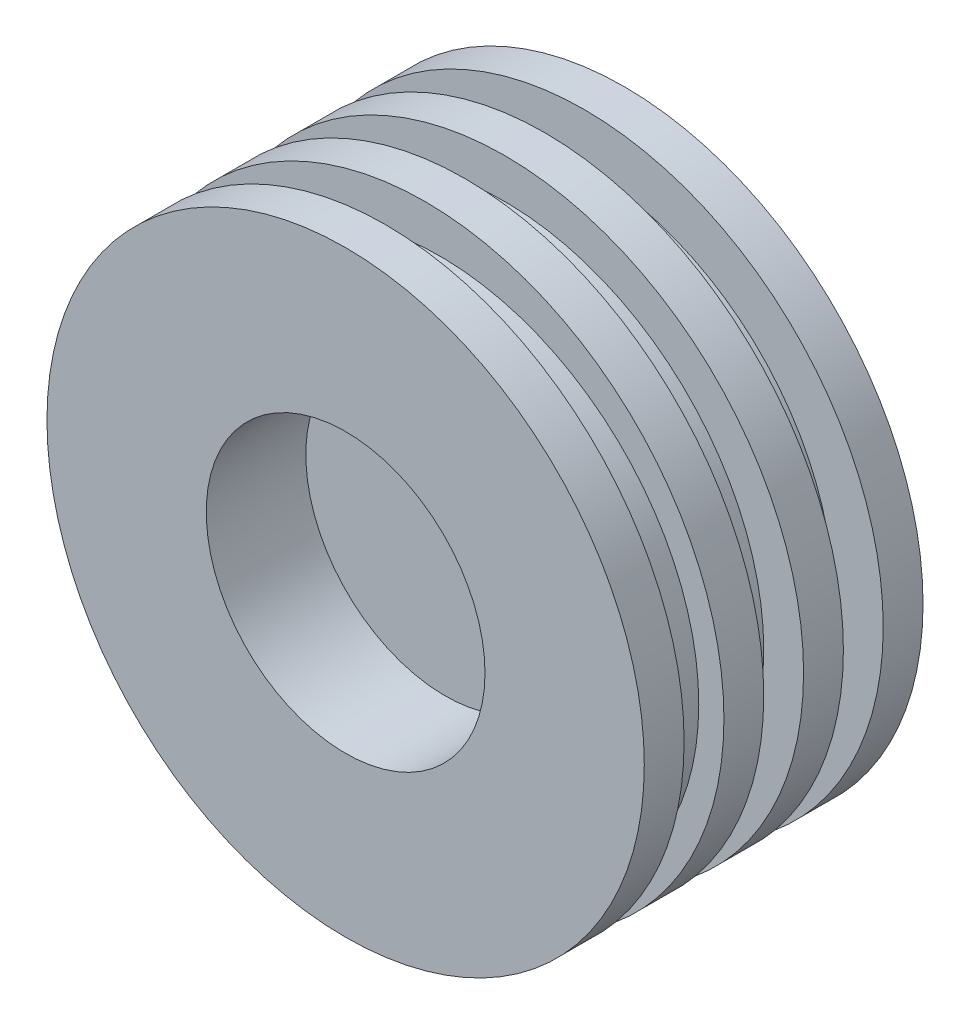
ISO-10303-21;
HEADER;
FILE_DESCRIPTION(('STEP AP214'),'2;1');
FILE_NAME('part.step','',(''),(''),'','','');
FILE_SCHEMA(('AUTOMOTIVE_DESIGN { 1 0 10303 214 1 1 1 1 }'));
ENDSEC;
DATA;
#1=APPLICATION_CONTEXT('core data for automotive mechanical design processes');
#2=APPLICATION_PROTOCOL_DEFINITION('international standard','automotive_design',2000,#1);
#3=PRODUCT_CONTEXT('',#1,'mechanical');
#4=PRODUCT('Part','Part','',(#3));
#5=PRODUCT_RELATED_PRODUCT_CATEGORY('part','',(#4));
#6=PRODUCT_DEFINITION_FORMATION('','',#4);
#7=PRODUCT_DEFINITION_CONTEXT('part definition',#1,'design');
#8=PRODUCT_DEFINITION('design','',#6,#7);
#9=PRODUCT_DEFINITION_SHAPE('','',#8);
#10=(LENGTH_UNIT() NAMED_UNIT(*) SI_UNIT(.MILLI.,.METRE.));
#11=(NAMED_UNIT(*) PLANE_ANGLE_UNIT() SI_UNIT($,.RADIAN.));
#12=(NAMED_UNIT(*) SI_UNIT($,.STERADIAN.) SOLID_ANGLE_UNIT());
#13=UNCERTAINTY_MEASURE_WITH_UNIT(LENGTH_MEASURE(1.E-05),#10,'distance_accuracy_value','');
#14=(GEOMETRIC_REPRESENTATION_CONTEXT(3) GLOBAL_UNCERTAINTY_ASSIGNED_CONTEXT((#13)) GLOBAL_UNIT_ASSIGNED_CONTEXT((#10,
#11,#12)) REPRESENTATION_CONTEXT('',''));
#15=CARTESIAN_POINT('',(0.,0.,0.));
#16=DIRECTION('',(0.,0.,1.));
#17=DIRECTION('',(1.,0.,0.));
#18=AXIS2_PLACEMENT_3D('',#15,#16,#17);
#19=CARTESIAN_POINT('',(0.,0.,2.));
#20=DIRECTION('',(0.,0.,-1.));
#21=DIRECTION('',(-1.,0.,0.));
#22=AXIS2_PLACEMENT_3D('',#19,#20,#21);
#23=CYLINDRICAL_SURFACE('',#22,15.);
#24=CARTESIAN_POINT('',(0.,0.,2.));
#25=DIRECTION('',(0.,0.,1.));
#26=DIRECTION('',(1.,0.,0.));
#27=AXIS2_PLACEMENT_3D('',#24,#25,#26);
#28=CIRCLE('',#27,15.);
#29=CARTESIAN_POINT('',(15.,0.,2.));
#30=VERTEX_POINT('',#29);
#31=EDGE_CURVE('E70',#30,#30,#28,.T.);
#32=ORIENTED_EDGE('',*,*,#31,.F.);
#33=EDGE_LOOP('',(#32));
#34=FACE_BOUND('',#33,.T.);
#35=CARTESIAN_POINT('',(0.,0.,0.));
#36=DIRECTION('',(0.,0.,1.));
#37=DIRECTION('',(1.,0.,0.));
#38=AXIS2_PLACEMENT_3D('',#35,#36,#37);
#39=CIRCLE('',#38,15.);
#40=CARTESIAN_POINT('',(15.,0.,0.));
#41=VERTEX_POINT('',#40);
#42=EDGE_CURVE('E36',#41,#41,#39,.T.);
#43=ORIENTED_EDGE('',*,*,#42,.T.);
#44=EDGE_LOOP('',(#43));
#45=FACE_BOUND('',#44,.T.);
#46=ADVANCED_FACE('F33',(#34,#45),#23,.T.);
#47=CARTESIAN_POINT('',(0.,0.,2.));
#48=DIRECTION('',(0.,0.,1.));
#49=DIRECTION('',(1.,0.,0.));
#50=AXIS2_PLACEMENT_3D('',#47,#48,#49);
#51=PLANE('',#50);
#52=CARTESIAN_POINT('',(0.,0.,2.));
#53=DIRECTION('',(0.,0.,1.));
#54=DIRECTION('',(1.,0.,0.));
#55=AXIS2_PLACEMENT_3D('',#52,#53,#54);
#56=CIRCLE('',#55,12.5);
#57=CARTESIAN_POINT('',(12.5,0.,2.));
#58=VERTEX_POINT('',#57);
#59=EDGE_CURVE('E45',#58,#58,#56,.T.);
#60=ORIENTED_EDGE('',*,*,#59,.F.);
#61=EDGE_LOOP('',(#60));
#62=FACE_BOUND('',#61,.T.);
#63=ORIENTED_EDGE('',*,*,#31,.T.);
#64=EDGE_LOOP('',(#63));
#65=FACE_BOUND('',#64,.T.);
#66=ADVANCED_FACE('F81',(#62,#65),#51,.T.);
#67=CARTESIAN_POINT('',(0.,0.,0.));
#68=DIRECTION('',(0.,0.,1.));
#69=DIRECTION('',(1.,0.,0.));
#70=AXIS2_PLACEMENT_3D('',#67,#68,#69);
#71=PLANE('',#70);
#72=ORIENTED_EDGE('',*,*,#42,.F.);
#73=EDGE_LOOP('',(#72));
#74=FACE_BOUND('',#73,.T.);
#75=ADVANCED_FACE('F78',(#74),#71,.F.);
#76=CARTESIAN_POINT('',(0.,0.,4.));
#77=DIRECTION('',(0.,0.,-1.));
#78=DIRECTION('',(-1.,0.,0.));
#79=AXIS2_PLACEMENT_3D('',#76,#77,#78);
#80=CYLINDRICAL_SURFACE('',#79,12.5);
#81=CARTESIAN_POINT('',(0.,0.,4.));
#82=DIRECTION('',(0.,0.,1.));
#83=DIRECTION('',(1.,0.,0.));
#84=AXIS2_PLACEMENT_3D('',#81,#82,#83);
#85=CIRCLE('',#84,12.5);
#86=CARTESIAN_POINT('',(12.5,0.,4.));
#87=VERTEX_POINT('',#86);
#88=EDGE_CURVE('E64',#87,#87,#85,.T.);
#89=ORIENTED_EDGE('',*,*,#88,.F.);
#90=EDGE_LOOP('',(#89));
#91=FACE_BOUND('',#90,.T.);
#92=ORIENTED_EDGE('',*,*,#59,.T.);
#93=EDGE_LOOP('',(#92));
#94=FACE_BOUND('',#93,.T.);
#95=ADVANCED_FACE('F80',(#91,#94),#80,.T.);
#96=CARTESIAN_POINT('',(0.,0.,6.));
#97=DIRECTION('',(0.,0.,-1.));
#98=DIRECTION('',(-1.,0.,0.));
#99=AXIS2_PLACEMENT_3D('',#96,#97,#98);
#100=CYLINDRICAL_SURFACE('',#99,15.);
#101=CARTESIAN_POINT('',(0.,0.,6.));
#102=DIRECTION('',(0.,0.,1.));
#103=DIRECTION('',(1.,0.,0.));
#104=AXIS2_PLACEMENT_3D('',#101,#102,#103);
#105=CIRCLE('',#104,15.);
#106=CARTESIAN_POINT('',(15.,0.,6.));
#107=VERTEX_POINT('',#106);
#108=EDGE_CURVE('E61',#107,#107,#105,.T.);
#109=ORIENTED_EDGE('',*,*,#108,.F.);
#110=EDGE_LOOP('',(#109));
#111=FACE_BOUND('',#110,.T.);
#112=CARTESIAN_POINT('',(0.,0.,4.));
#113=DIRECTION('',(0.,0.,1.));
#114=DIRECTION('',(1.,0.,0.));
#115=AXIS2_PLACEMENT_3D('',#112,#113,#114);
#116=CIRCLE('',#115,15.);
#117=CARTESIAN_POINT('',(15.,0.,4.));
#118=VERTEX_POINT('',#117);
#119=EDGE_CURVE('E59',#118,#118,#116,.T.);
#120=ORIENTED_EDGE('',*,*,#119,.T.);
#121=EDGE_LOOP('',(#120));
#122=FACE_BOUND('',#121,.T.);
#123=ADVANCED_FACE('F86',(#111,#122),#100,.T.);
#124=CARTESIAN_POINT('',(0.,0.,6.));
#125=DIRECTION('',(0.,0.,1.));
#126=DIRECTION('',(1.,0.,0.));
#127=AXIS2_PLACEMENT_3D('',#124,#125,#126);
#128=PLANE('',#127);
#129=CARTESIAN_POINT('',(0.,0.,6.));
#130=DIRECTION('',(0.,0.,1.));
#131=DIRECTION('',(1.,0.,0.));
#132=AXIS2_PLACEMENT_3D('',#129,#130,#131);
#133=CIRCLE('',#132,13.);
#134=CARTESIAN_POINT('',(13.,0.,6.));
#135=VERTEX_POINT('',#134);
#136=EDGE_CURVE('E40',#135,#135,#133,.T.);
#137=ORIENTED_EDGE('',*,*,#136,.F.);
#138=EDGE_LOOP('',(#137));
#139=FACE_BOUND('',#138,.T.);
#140=ORIENTED_EDGE('',*,*,#108,.T.);
#141=EDGE_LOOP('',(#140));
#142=FACE_BOUND('',#141,.T.);
#143=ADVANCED_FACE('F116',(#139,#142),#128,.T.);
#144=CARTESIAN_POINT('',(0.,0.,4.));
#145=DIRECTION('',(0.,0.,1.));
#146=DIRECTION('',(1.,0.,0.));
#147=AXIS2_PLACEMENT_3D('',#144,#145,#146);
#148=PLANE('',#147);
#149=ORIENTED_EDGE('',*,*,#88,.T.);
#150=EDGE_LOOP('',(#149));
#151=FACE_BOUND('',#150,.T.);
#152=ORIENTED_EDGE('',*,*,#119,.F.);
#153=EDGE_LOOP('',(#152));
#154=FACE_BOUND('',#153,.T.);
#155=ADVANCED_FACE('F124',(#151,#154),#148,.F.);
#156=CARTESIAN_POINT('',(0.,0.,8.));
#157=DIRECTION('',(0.,0.,-1.));
#158=DIRECTION('',(-1.,0.,0.));
#159=AXIS2_PLACEMENT_3D('',#156,#157,#158);
#160=CYLINDRICAL_SURFACE('',#159,13.);
#161=CARTESIAN_POINT('',(0.,0.,8.));
#162=DIRECTION('',(0.,0.,1.));
#163=DIRECTION('',(1.,0.,0.));
#164=AXIS2_PLACEMENT_3D('',#161,#162,#163);
#165=CIRCLE('',#164,13.);
#166=CARTESIAN_POINT('',(13.,0.,8.));
#167=VERTEX_POINT('',#166);
#168=EDGE_CURVE('E54',#167,#167,#165,.T.);
#169=ORIENTED_EDGE('',*,*,#168,.F.);
#170=EDGE_LOOP('',(#169));
#171=FACE_BOUND('',#170,.T.);
#172=ORIENTED_EDGE('',*,*,#136,.T.);
#173=EDGE_LOOP('',(#172));
#174=FACE_BOUND('',#173,.T.);
#175=ADVANCED_FACE('F129',(#171,#174),#160,.T.);
#176=CARTESIAN_POINT('',(0.,0.,10.));
#177=DIRECTION('',(0.,0.,-1.));
#178=DIRECTION('',(-1.,0.,0.));
#179=AXIS2_PLACEMENT_3D('',#176,#177,#178);
#180=CYLINDRICAL_SURFACE('',#179,15.);
#181=CARTESIAN_POINT('',(0.,0.,10.));
#182=DIRECTION('',(0.,0.,1.));
#183=DIRECTION('',(1.,0.,0.));
#184=AXIS2_PLACEMENT_3D('',#181,#182,#183);
#185=CIRCLE('',#184,15.);
#186=CARTESIAN_POINT('',(15.,0.,10.));
#187=VERTEX_POINT('',#186);
#188=EDGE_CURVE('E51',#187,#187,#185,.T.);
#189=ORIENTED_EDGE('',*,*,#188,.F.);
#190=EDGE_LOOP('',(#189));
#191=FACE_BOUND('',#190,.T.);
#192=CARTESIAN_POINT('',(0.,0.,8.));
#193=DIRECTION('',(0.,0.,1.));
#194=DIRECTION('',(1.,0.,0.));
#195=AXIS2_PLACEMENT_3D('',#192,#193,#194);
#196=CIRCLE('',#195,15.);
#197=CARTESIAN_POINT('',(15.,0.,8.));
#198=VERTEX_POINT('',#197);
#199=EDGE_CURVE('E55',#198,#198,#196,.T.);
#200=ORIENTED_EDGE('',*,*,#199,.T.);
#201=EDGE_LOOP('',(#200));
#202=FACE_BOUND('',#201,.T.);
#203=ADVANCED_FACE('F146',(#191,#202),#180,.T.);
#204=CARTESIAN_POINT('',(0.,0.,10.));
#205=DIRECTION('',(0.,0.,1.));
#206=DIRECTION('',(1.,0.,0.));
#207=AXIS2_PLACEMENT_3D('',#204,#205,#206);
#208=PLANE('',#207);
#209=CARTESIAN_POINT('',(0.7361946892388,0.,10.));
#210=DIRECTION('',(0.,0.,1.));
#211=DIRECTION('',(1.,0.,0.));
#212=AXIS2_PLACEMENT_3D('',#209,#210,#211);
#213=CIRCLE('',#212,13.);
#214=CARTESIAN_POINT('',(13.7361946892388,0.,10.));
#215=VERTEX_POINT('',#214);
#216=EDGE_CURVE('E10',#215,#215,#213,.T.);
#217=ORIENTED_EDGE('',*,*,#216,.F.);
#218=EDGE_LOOP('',(#217));
#219=FACE_BOUND('',#218,.T.);
#220=ORIENTED_EDGE('',*,*,#188,.T.);
#221=EDGE_LOOP('',(#220));
#222=FACE_BOUND('',#221,.T.);
#223=ADVANCED_FACE('F156',(#219,#222),#208,.T.);
#224=CARTESIAN_POINT('',(0.,0.,8.));
#225=DIRECTION('',(0.,0.,1.));
#226=DIRECTION('',(1.,0.,0.));
#227=AXIS2_PLACEMENT_3D('',#224,#225,#226);
#228=PLANE('',#227);
#229=ORIENTED_EDGE('',*,*,#168,.T.);
#230=EDGE_LOOP('',(#229));
#231=FACE_BOUND('',#230,.T.);
#232=ORIENTED_EDGE('',*,*,#199,.F.);
#233=EDGE_LOOP('',(#232));
#234=FACE_BOUND('',#233,.T.);
#235=ADVANCED_FACE('F164',(#231,#234),#228,.F.);
#236=CARTESIAN_POINT('',(0.7361946892388,0.,12.));
#237=DIRECTION('',(0.,0.,-1.));
#238=DIRECTION('',(-1.,0.,0.));
#239=AXIS2_PLACEMENT_3D('',#236,#237,#238);
#240=CYLINDRICAL_SURFACE('',#239,13.);
#241=CARTESIAN_POINT('',(0.7361946892388,0.,12.));
#242=DIRECTION('',(0.,0.,1.));
#243=DIRECTION('',(1.,0.,0.));
#244=AXIS2_PLACEMENT_3D('',#241,#242,#243);
#245=CIRCLE('',#244,13.);
#246=CARTESIAN_POINT('',(13.7361946892388,0.,12.));
#247=VERTEX_POINT('',#246);
#248=EDGE_CURVE('E49',#247,#247,#245,.T.);
#249=ORIENTED_EDGE('',*,*,#248,.F.);
#250=EDGE_LOOP('',(#249));
#251=FACE_BOUND('',#250,.T.);
#252=ORIENTED_EDGE('',*,*,#216,.T.);
#253=EDGE_LOOP('',(#252));
#254=FACE_BOUND('',#253,.T.);
#255=ADVANCED_FACE('F169',(#251,#254),#240,.T.);
#256=CARTESIAN_POINT('',(0.,0.,14.));
#257=DIRECTION('',(0.,0.,-1.));
#258=DIRECTION('',(-1.,0.,0.));
#259=AXIS2_PLACEMENT_3D('',#256,#257,#258);
#260=CYLINDRICAL_SURFACE('',#259,15.);
#261=CARTESIAN_POINT('',(0.,0.,14.));
#262=DIRECTION('',(0.,0.,1.));
#263=DIRECTION('',(1.,0.,0.));
#264=AXIS2_PLACEMENT_3D('',#261,#262,#263);
#265=CIRCLE('',#264,15.);
#266=CARTESIAN_POINT('',(15.,0.,14.));
#267=VERTEX_POINT('',#266);
#268=EDGE_CURVE('E247',#267,#267,#265,.T.);
#269=ORIENTED_EDGE('',*,*,#268,.F.);
#270=EDGE_LOOP('',(#269));
#271=FACE_BOUND('',#270,.T.);
#272=CARTESIAN_POINT('',(0.,0.,12.));
#273=DIRECTION('',(0.,0.,1.));
#274=DIRECTION('',(1.,0.,0.));
#275=AXIS2_PLACEMENT_3D('',#272,#273,#274);
#276=CIRCLE('',#275,15.);
#277=CARTESIAN_POINT('',(15.,0.,12.));
#278=VERTEX_POINT('',#277);
#279=EDGE_CURVE('E243',#278,#278,#276,.T.);
#280=ORIENTED_EDGE('',*,*,#279,.T.);
#281=EDGE_LOOP('',(#280));
#282=FACE_BOUND('',#281,.T.);
#283=ADVANCED_FACE('F186',(#271,#282),#260,.T.);
#284=CARTESIAN_POINT('',(0.,0.,14.));
#285=DIRECTION('',(0.,0.,1.));
#286=DIRECTION('',(1.,0.,0.));
#287=AXIS2_PLACEMENT_3D('',#284,#285,#286);
#288=PLANE('',#287);
#289=CARTESIAN_POINT('',(0.,0.,14.));
#290=DIRECTION('',(0.,0.,1.));
#291=DIRECTION('',(1.,0.,0.));
#292=AXIS2_PLACEMENT_3D('',#289,#290,#291);
#293=CIRCLE('',#292,7.);
#294=CARTESIAN_POINT('',(7.,0.,14.));
#295=VERTEX_POINT('',#294);
#296=EDGE_CURVE('E244',#295,#295,#293,.T.);
#297=ORIENTED_EDGE('',*,*,#296,.F.);
#298=EDGE_LOOP('',(#297));
#299=FACE_BOUND('',#298,.T.);
#300=ORIENTED_EDGE('',*,*,#268,.T.);
#301=EDGE_LOOP('',(#300));
#302=FACE_BOUND('',#301,.T.);
#303=ADVANCED_FACE('F196',(#299,#302),#288,.T.);
#304=CARTESIAN_POINT('',(0.,0.,12.));
#305=DIRECTION('',(0.,0.,1.));
#306=DIRECTION('',(1.,0.,0.));
#307=AXIS2_PLACEMENT_3D('',#304,#305,#306);
#308=PLANE('',#307);
#309=ORIENTED_EDGE('',*,*,#248,.T.);
#310=EDGE_LOOP('',(#309));
#311=FACE_BOUND('',#310,.T.);
#312=ORIENTED_EDGE('',*,*,#279,.F.);
#313=EDGE_LOOP('',(#312));
#314=FACE_BOUND('',#313,.T.);
#315=ADVANCED_FACE('F204',(#311,#314),#308,.F.);
#316=CARTESIAN_POINT('',(0.,0.,9.));
#317=DIRECTION('',(0.,0.,1.));
#318=DIRECTION('',(1.,0.,0.));
#319=AXIS2_PLACEMENT_3D('',#316,#317,#318);
#320=CYLINDRICAL_SURFACE('',#319,7.);
#321=CARTESIAN_POINT('',(0.,0.,9.));
#322=DIRECTION('',(0.,0.,1.));
#323=DIRECTION('',(1.,0.,0.));
#324=AXIS2_PLACEMENT_3D('',#321,#322,#323);
#325=CIRCLE('',#324,7.);
#326=CARTESIAN_POINT('',(7.,0.,9.));
#327=VERTEX_POINT('',#326);
#328=EDGE_CURVE('E242',#327,#327,#325,.T.);
#329=ORIENTED_EDGE('',*,*,#328,.F.);
#330=EDGE_LOOP('',(#329));
#331=FACE_BOUND('',#330,.T.);
#332=ORIENTED_EDGE('',*,*,#296,.T.);
#333=EDGE_LOOP('',(#332));
#334=FACE_BOUND('',#333,.T.);
#335=ADVANCED_FACE('F209',(#331,#334),#320,.F.);
#336=CARTESIAN_POINT('',(0.,0.,9.));
#337=DIRECTION('',(0.,0.,1.));
#338=DIRECTION('',(1.,0.,0.));
#339=AXIS2_PLACEMENT_3D('',#336,#337,#338);
#340=PLANE('',#339);
#341=ORIENTED_EDGE('',*,*,#328,.T.);
#342=EDGE_LOOP('',(#341));
#343=FACE_BOUND('',#342,.T.);
#344=ADVANCED_FACE('F226',(#343),#340,.T.);
#345=CLOSED_SHELL('',(#46,#66,#75,#95,#123,#143,#155,#175,#203,#223,#235,#255,#283,#303,#315,
#335,#344));
#346=MANIFOLD_SOLID_BREP('B2',#345);
#347=ADVANCED_BREP_SHAPE_REPRESENTATION('',(#18,#346),#14);
#348=SHAPE_DEFINITION_REPRESENTATION(#9,#347);
ENDSEC;
END-ISO-10303-21;
